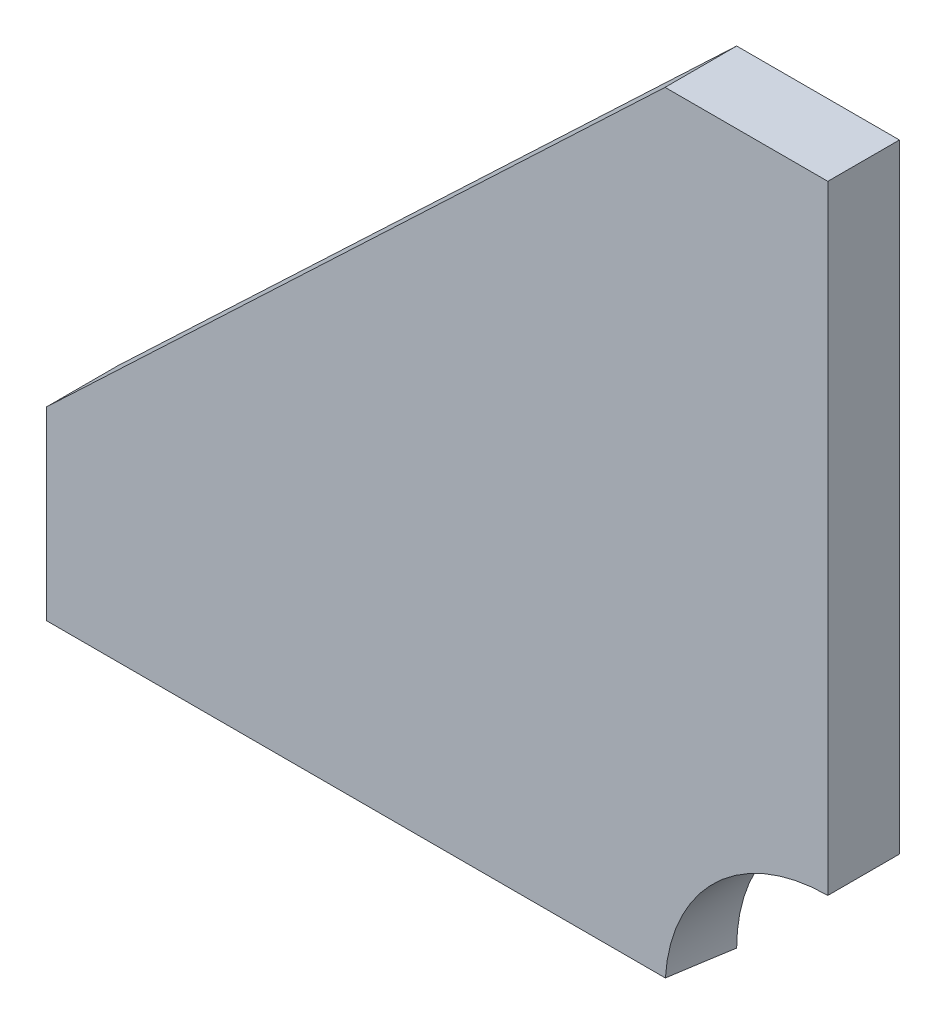
ISO-10303-21;
HEADER;
FILE_DESCRIPTION(('STEP AP214'),'2;1');
FILE_NAME('part.step','',(''),(''),'','','');
FILE_SCHEMA(('AUTOMOTIVE_DESIGN { 1 0 10303 214 1 1 1 1 }'));
ENDSEC;
DATA;
#1=APPLICATION_CONTEXT('core data for automotive mechanical design processes');
#2=APPLICATION_PROTOCOL_DEFINITION('international standard','automotive_design',2000,#1);
#3=PRODUCT_CONTEXT('',#1,'mechanical');
#4=PRODUCT('Part','Part','',(#3));
#5=PRODUCT_RELATED_PRODUCT_CATEGORY('part','',(#4));
#6=PRODUCT_DEFINITION_FORMATION('','',#4);
#7=PRODUCT_DEFINITION_CONTEXT('part definition',#1,'design');
#8=PRODUCT_DEFINITION('design','',#6,#7);
#9=PRODUCT_DEFINITION_SHAPE('','',#8);
#10=(LENGTH_UNIT() NAMED_UNIT(*) SI_UNIT(.MILLI.,.METRE.));
#11=(NAMED_UNIT(*) PLANE_ANGLE_UNIT() SI_UNIT($,.RADIAN.));
#12=(NAMED_UNIT(*) SI_UNIT($,.STERADIAN.) SOLID_ANGLE_UNIT());
#13=UNCERTAINTY_MEASURE_WITH_UNIT(LENGTH_MEASURE(1.E-05),#10,'distance_accuracy_value','');
#14=(GEOMETRIC_REPRESENTATION_CONTEXT(3) GLOBAL_UNCERTAINTY_ASSIGNED_CONTEXT((#13)) GLOBAL_UNIT_ASSIGNED_CONTEXT((#10,
#11,#12)) REPRESENTATION_CONTEXT('',''));
#15=CARTESIAN_POINT('',(0.,0.,0.));
#16=DIRECTION('',(0.,0.,1.));
#17=DIRECTION('',(1.,0.,0.));
#18=AXIS2_PLACEMENT_3D('',#15,#16,#17);
#19=CARTESIAN_POINT('',(25.,-120.,11.));
#20=DIRECTION('',(0.,0.,-1.));
#21=DIRECTION('',(-1.,0.,0.));
#22=AXIS2_PLACEMENT_3D('',#19,#20,#21);
#23=CYLINDRICAL_SURFACE('',#22,25.);
#24=CARTESIAN_POINT('',(25.,-120.,0.));
#25=DIRECTION('',(0.,0.990268068741571,-0.139173100960059));
#26=DIRECTION('',(0.,-0.139173100960059,-0.990268068741571));
#27=AXIS2_PLACEMENT_3D('',#24,#25,#26);
#28=ELLIPSE('',#27,179.632413358201,25.);
#29=CARTESIAN_POINT('',(0.,-120.,0.));
#30=VERTEX_POINT('',#29);
#31=CARTESIAN_POINT('',(0.0478449602540551,-118.454050818274,11.));
#32=VERTEX_POINT('',#31);
#33=EDGE_CURVE('E107',#30,#32,#28,.T.);
#34=ORIENTED_EDGE('',*,*,#33,.F.);
#35=CARTESIAN_POINT('',(25.,-120.,0.));
#36=DIRECTION('',(0.,0.,1.));
#37=DIRECTION('',(1.,0.,0.));
#38=AXIS2_PLACEMENT_3D('',#35,#36,#37);
#39=CIRCLE('',#38,25.);
#40=CARTESIAN_POINT('',(25.,-95.,0.));
#41=VERTEX_POINT('',#40);
#42=EDGE_CURVE('E126',#41,#30,#39,.T.);
#43=ORIENTED_EDGE('',*,*,#42,.F.);
#44=DIRECTION('',(0.,0.,-1.));
#45=VECTOR('',#44,1.);
#46=CARTESIAN_POINT('',(25.,-95.,11.));
#47=LINE('',#46,#45);
#48=CARTESIAN_POINT('',(25.,-95.,11.));
#49=VERTEX_POINT('',#48);
#50=EDGE_CURVE('E11',#49,#41,#47,.T.);
#51=ORIENTED_EDGE('',*,*,#50,.F.);
#52=CARTESIAN_POINT('',(25.,-120.,11.));
#53=DIRECTION('',(0.,0.,1.));
#54=DIRECTION('',(1.,0.,0.));
#55=AXIS2_PLACEMENT_3D('',#52,#53,#54);
#56=CIRCLE('',#55,25.);
#57=EDGE_CURVE('E138',#49,#32,#56,.T.);
#58=ORIENTED_EDGE('',*,*,#57,.T.);
#59=EDGE_LOOP('',(#34,#43,#51,#58));
#60=FACE_BOUND('',#59,.T.);
#61=ADVANCED_FACE('F45',(#60),#23,.F.);
#62=CARTESIAN_POINT('',(25.,0.,11.));
#63=DIRECTION('',(1.,0.,0.));
#64=DIRECTION('',(0.,1.,0.));
#65=AXIS2_PLACEMENT_3D('',#62,#63,#64);
#66=PLANE('',#65);
#67=DIRECTION('',(0.,-1.,0.));
#68=VECTOR('',#67,1.);
#69=CARTESIAN_POINT('',(25.,0.,0.));
#70=LINE('',#69,#68);
#71=CARTESIAN_POINT('',(25.,0.,0.));
#72=VERTEX_POINT('',#71);
#73=EDGE_CURVE('E129',#72,#41,#70,.T.);
#74=ORIENTED_EDGE('',*,*,#73,.F.);
#75=DIRECTION('',(0.,0.,-1.));
#76=VECTOR('',#75,1.);
#77=CARTESIAN_POINT('',(25.,0.,11.));
#78=LINE('',#77,#76);
#79=CARTESIAN_POINT('',(25.,0.,11.));
#80=VERTEX_POINT('',#79);
#81=EDGE_CURVE('E53',#80,#72,#78,.T.);
#82=ORIENTED_EDGE('',*,*,#81,.F.);
#83=DIRECTION('',(0.,-1.,0.));
#84=VECTOR('',#83,1.);
#85=CARTESIAN_POINT('',(25.,0.,11.));
#86=LINE('',#85,#84);
#87=EDGE_CURVE('E154',#80,#49,#86,.T.);
#88=ORIENTED_EDGE('',*,*,#87,.T.);
#89=ORIENTED_EDGE('',*,*,#50,.T.);
#90=EDGE_LOOP('',(#74,#82,#88,#89));
#91=FACE_BOUND('',#90,.T.);
#92=ADVANCED_FACE('F148',(#91),#66,.T.);
#93=CARTESIAN_POINT('',(0.,0.,11.));
#94=DIRECTION('',(0.,1.,0.));
#95=DIRECTION('',(0.,0.,1.));
#96=AXIS2_PLACEMENT_3D('',#93,#94,#95);
#97=PLANE('',#96);
#98=DIRECTION('',(1.,0.,0.));
#99=VECTOR('',#98,1.);
#100=CARTESIAN_POINT('',(0.,0.,0.));
#101=LINE('',#100,#99);
#102=CARTESIAN_POINT('',(0.,0.,0.));
#103=VERTEX_POINT('',#102);
#104=EDGE_CURVE('E132',#103,#72,#101,.T.);
#105=ORIENTED_EDGE('',*,*,#104,.F.);
#106=DIRECTION('',(0.,0.,-1.));
#107=VECTOR('',#106,1.);
#108=CARTESIAN_POINT('',(0.,0.,11.));
#109=LINE('',#108,#107);
#110=CARTESIAN_POINT('',(0.,0.,11.));
#111=VERTEX_POINT('',#110);
#112=EDGE_CURVE('E120',#111,#103,#109,.T.);
#113=ORIENTED_EDGE('',*,*,#112,.F.);
#114=DIRECTION('',(1.,0.,0.));
#115=VECTOR('',#114,1.);
#116=CARTESIAN_POINT('',(0.,0.,11.));
#117=LINE('',#116,#115);
#118=EDGE_CURVE('E122',#111,#80,#117,.T.);
#119=ORIENTED_EDGE('',*,*,#118,.T.);
#120=ORIENTED_EDGE('',*,*,#81,.T.);
#121=EDGE_LOOP('',(#105,#113,#119,#120));
#122=FACE_BOUND('',#121,.T.);
#123=ADVANCED_FACE('F144',(#122),#97,.T.);
#124=CARTESIAN_POINT('',(0.,0.,11.));
#125=DIRECTION('',(0.687744647910783,-0.725952683905827,0.));
#126=DIRECTION('',(0.725952683905827,0.687744647910783,0.));
#127=AXIS2_PLACEMENT_3D('',#124,#125,#126);
#128=PLANE('',#127);
#129=DIRECTION('',(-0.725952683905827,-0.687744647910783,0.));
#130=VECTOR('',#129,1.);
#131=CARTESIAN_POINT('',(0.,0.,0.));
#132=LINE('',#131,#130);
#133=CARTESIAN_POINT('',(-95.,-90.,0.));
#134=VERTEX_POINT('',#133);
#135=EDGE_CURVE('E80',#103,#134,#132,.T.);
#136=ORIENTED_EDGE('',*,*,#135,.T.);
#137=DIRECTION('',(0.,0.,-1.));
#138=VECTOR('',#137,1.);
#139=CARTESIAN_POINT('',(-95.,-90.,11.));
#140=LINE('',#139,#138);
#141=CARTESIAN_POINT('',(-95.,-90.,11.));
#142=VERTEX_POINT('',#141);
#143=EDGE_CURVE('E118',#142,#134,#140,.T.);
#144=ORIENTED_EDGE('',*,*,#143,.F.);
#145=DIRECTION('',(-0.725952683905827,-0.687744647910783,0.));
#146=VECTOR('',#145,1.);
#147=CARTESIAN_POINT('',(0.,0.,11.));
#148=LINE('',#147,#146);
#149=EDGE_CURVE('E61',#111,#142,#148,.T.);
#150=ORIENTED_EDGE('',*,*,#149,.F.);
#151=ORIENTED_EDGE('',*,*,#112,.T.);
#152=EDGE_LOOP('',(#136,#144,#150,#151));
#153=FACE_BOUND('',#152,.T.);
#154=ADVANCED_FACE('F164',(#153),#128,.F.);
#155=CARTESIAN_POINT('',(-95.,0.,11.));
#156=DIRECTION('',(1.,0.,0.));
#157=DIRECTION('',(0.,0.,-1.));
#158=AXIS2_PLACEMENT_3D('',#155,#156,#157);
#159=PLANE('',#158);
#160=DIRECTION('',(0.,-1.,0.));
#161=VECTOR('',#160,1.);
#162=CARTESIAN_POINT('',(-95.,0.,0.));
#163=LINE('',#162,#161);
#164=CARTESIAN_POINT('',(-95.,-120.,0.));
#165=VERTEX_POINT('',#164);
#166=EDGE_CURVE('E114',#134,#165,#163,.T.);
#167=ORIENTED_EDGE('',*,*,#166,.T.);
#168=DIRECTION('',(0.,-0.139173100960059,-0.990268068741571));
#169=VECTOR('',#168,1.);
#170=CARTESIAN_POINT('',(-95.,-118.454050818274,11.));
#171=LINE('',#170,#169);
#172=CARTESIAN_POINT('',(-95.,-118.454050818274,11.));
#173=VERTEX_POINT('',#172);
#174=EDGE_CURVE('E88',#173,#165,#171,.T.);
#175=ORIENTED_EDGE('',*,*,#174,.F.);
#176=DIRECTION('',(0.,-1.,0.));
#177=VECTOR('',#176,1.);
#178=CARTESIAN_POINT('',(-95.,0.,11.));
#179=LINE('',#178,#177);
#180=EDGE_CURVE('E112',#142,#173,#179,.T.);
#181=ORIENTED_EDGE('',*,*,#180,.F.);
#182=ORIENTED_EDGE('',*,*,#143,.T.);
#183=EDGE_LOOP('',(#167,#175,#181,#182));
#184=FACE_BOUND('',#183,.T.);
#185=ADVANCED_FACE('F111',(#184),#159,.F.);
#186=CARTESIAN_POINT('',(0.,0.,11.));
#187=DIRECTION('',(0.,0.,1.));
#188=DIRECTION('',(1.,0.,0.));
#189=AXIS2_PLACEMENT_3D('',#186,#187,#188);
#190=PLANE('',#189);
#191=DIRECTION('',(-1.,0.,0.));
#192=VECTOR('',#191,1.);
#193=CARTESIAN_POINT('',(21.,-118.454050818274,11.));
#194=LINE('',#193,#192);
#195=EDGE_CURVE('E104',#32,#173,#194,.T.);
#196=ORIENTED_EDGE('',*,*,#195,.F.);
#197=ORIENTED_EDGE('',*,*,#57,.F.);
#198=ORIENTED_EDGE('',*,*,#87,.F.);
#199=ORIENTED_EDGE('',*,*,#118,.F.);
#200=ORIENTED_EDGE('',*,*,#149,.T.);
#201=ORIENTED_EDGE('',*,*,#180,.T.);
#202=EDGE_LOOP('',(#196,#197,#198,#199,#200,#201));
#203=FACE_BOUND('',#202,.T.);
#204=ADVANCED_FACE('F117',(#203),#190,.T.);
#205=CARTESIAN_POINT('',(0.,0.,0.));
#206=DIRECTION('',(0.,0.,1.));
#207=DIRECTION('',(1.,0.,0.));
#208=AXIS2_PLACEMENT_3D('',#205,#206,#207);
#209=PLANE('',#208);
#210=ORIENTED_EDGE('',*,*,#42,.T.);
#211=DIRECTION('',(1.,0.,0.));
#212=VECTOR('',#211,1.);
#213=CARTESIAN_POINT('',(0.,-120.,0.));
#214=LINE('',#213,#212);
#215=EDGE_CURVE('E137',#165,#30,#214,.T.);
#216=ORIENTED_EDGE('',*,*,#215,.F.);
#217=ORIENTED_EDGE('',*,*,#166,.F.);
#218=ORIENTED_EDGE('',*,*,#135,.F.);
#219=ORIENTED_EDGE('',*,*,#104,.T.);
#220=ORIENTED_EDGE('',*,*,#73,.T.);
#221=EDGE_LOOP('',(#210,#216,#217,#218,#219,#220));
#222=FACE_BOUND('',#221,.T.);
#223=ADVANCED_FACE('F150',(#222),#209,.F.);
#224=CARTESIAN_POINT('',(21.,-118.454050818274,11.));
#225=DIRECTION('',(0.,0.990268068741571,-0.139173100960059));
#226=DIRECTION('',(0.,0.139173100960059,0.990268068741571));
#227=AXIS2_PLACEMENT_3D('',#224,#225,#226);
#228=PLANE('',#227);
#229=ORIENTED_EDGE('',*,*,#33,.T.);
#230=ORIENTED_EDGE('',*,*,#195,.T.);
#231=ORIENTED_EDGE('',*,*,#174,.T.);
#232=ORIENTED_EDGE('',*,*,#215,.T.);
#233=EDGE_LOOP('',(#229,#230,#231,#232));
#234=FACE_BOUND('',#233,.T.);
#235=ADVANCED_FACE('F105',(#234),#228,.F.);
#236=CLOSED_SHELL('',(#61,#92,#123,#154,#185,#204,#223,#235));
#237=MANIFOLD_SOLID_BREP('B2',#236);
#238=ADVANCED_BREP_SHAPE_REPRESENTATION('',(#18,#237),#14);
#239=SHAPE_DEFINITION_REPRESENTATION(#9,#238);
ENDSEC;
END-ISO-10303-21;
